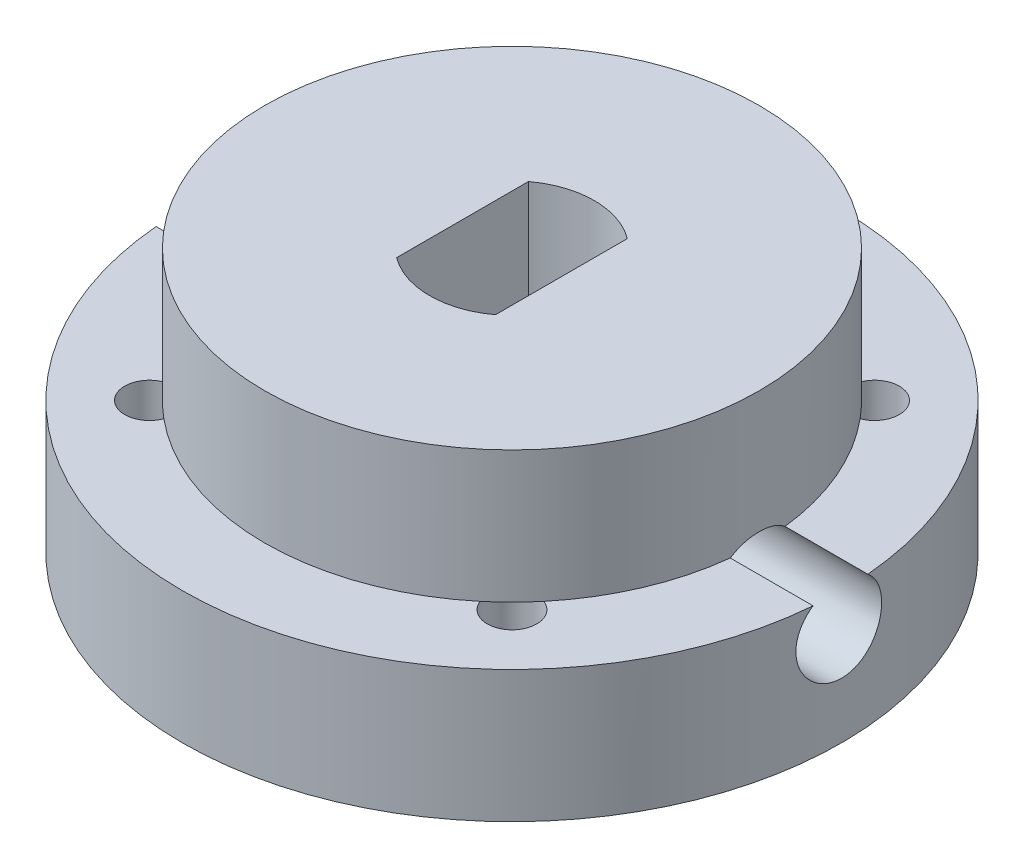
ISO-10303-21;
HEADER;
FILE_DESCRIPTION(('STEP AP214'),'2;1');
FILE_NAME('part.step','',(''),(''),'','','');
FILE_SCHEMA(('AUTOMOTIVE_DESIGN { 1 0 10303 214 1 1 1 1 }'));
ENDSEC;
DATA;
#1=APPLICATION_CONTEXT('core data for automotive mechanical design processes');
#2=APPLICATION_PROTOCOL_DEFINITION('international standard','automotive_design',2000,#1);
#3=PRODUCT_CONTEXT('',#1,'mechanical');
#4=PRODUCT('Part','Part','',(#3));
#5=PRODUCT_RELATED_PRODUCT_CATEGORY('part','',(#4));
#6=PRODUCT_DEFINITION_FORMATION('','',#4);
#7=PRODUCT_DEFINITION_CONTEXT('part definition',#1,'design');
#8=PRODUCT_DEFINITION('design','',#6,#7);
#9=PRODUCT_DEFINITION_SHAPE('','',#8);
#10=(LENGTH_UNIT() NAMED_UNIT(*) SI_UNIT(.MILLI.,.METRE.));
#11=(NAMED_UNIT(*) PLANE_ANGLE_UNIT() SI_UNIT($,.RADIAN.));
#12=(NAMED_UNIT(*) SI_UNIT($,.STERADIAN.) SOLID_ANGLE_UNIT());
#13=UNCERTAINTY_MEASURE_WITH_UNIT(LENGTH_MEASURE(1.E-05),#10,'distance_accuracy_value','');
#14=(GEOMETRIC_REPRESENTATION_CONTEXT(3) GLOBAL_UNCERTAINTY_ASSIGNED_CONTEXT((#13)) GLOBAL_UNIT_ASSIGNED_CONTEXT((#10,
#11,#12)) REPRESENTATION_CONTEXT('',''));
#15=CARTESIAN_POINT('',(0.,0.,0.));
#16=DIRECTION('',(0.,0.,1.));
#17=DIRECTION('',(1.,0.,0.));
#18=AXIS2_PLACEMENT_3D('',#15,#16,#17);
#19=CARTESIAN_POINT('',(0.,4.,0.));
#20=DIRECTION('',(0.,1.,0.));
#21=DIRECTION('',(0.,0.,1.));
#22=AXIS2_PLACEMENT_3D('',#19,#20,#21);
#23=PLANE('',#22);
#24=CARTESIAN_POINT('',(-5.5,4.,5.5));
#25=DIRECTION('',(0.,1.,0.));
#26=DIRECTION('',(0.,0.,1.));
#27=AXIS2_PLACEMENT_3D('',#24,#25,#26);
#28=CIRCLE('',#27,0.75);
#29=CARTESIAN_POINT('',(-5.76436327605439,4.,4.79813672394561));
#30=VERTEX_POINT('',#29);
#31=CARTESIAN_POINT('',(-4.79813672394561,4.,5.76436327605439));
#32=VERTEX_POINT('',#31);
#33=EDGE_CURVE('E518',#30,#32,#28,.T.);
#34=ORIENTED_EDGE('',*,*,#33,.F.);
#35=CARTESIAN_POINT('',(0.,4.,0.));
#36=DIRECTION('',(0.,1.,0.));
#37=DIRECTION('',(0.,0.,1.));
#38=AXIS2_PLACEMENT_3D('',#35,#36,#37);
#39=CIRCLE('',#38,7.5);
#40=CARTESIAN_POINT('',(-7.45385806143369,4.,0.830662386291808));
#41=VERTEX_POINT('',#40);
#42=EDGE_CURVE('E166',#41,#30,#39,.T.);
#43=ORIENTED_EDGE('',*,*,#42,.F.);
#44=DIRECTION('',(1.,0.,0.));
#45=VECTOR('',#44,1.);
#46=CARTESIAN_POINT('',(-10.,4.,0.830662386291809));
#47=LINE('',#46,#45);
#48=CARTESIAN_POINT('',(-9.96544028129214,4.,0.830662386291809));
#49=VERTEX_POINT('',#48);
#50=EDGE_CURVE('E266',#49,#41,#47,.T.);
#51=ORIENTED_EDGE('',*,*,#50,.F.);
#52=CARTESIAN_POINT('',(0.,4.,0.));
#53=DIRECTION('',(0.,1.,0.));
#54=DIRECTION('',(0.,0.,1.));
#55=AXIS2_PLACEMENT_3D('',#52,#53,#54);
#56=CIRCLE('',#55,10.);
#57=CARTESIAN_POINT('',(9.96544028129214,4.,0.830662386291806));
#58=VERTEX_POINT('',#57);
#59=EDGE_CURVE('E178',#49,#58,#56,.T.);
#60=ORIENTED_EDGE('',*,*,#59,.T.);
#61=CARTESIAN_POINT('',(7.45385806143369,4.,0.830662386291807));
#62=VERTEX_POINT('',#61);
#63=EDGE_CURVE('E257',#62,#58,#47,.T.);
#64=ORIENTED_EDGE('',*,*,#63,.F.);
#65=CARTESIAN_POINT('',(5.76436327605439,4.,4.79813672394561));
#66=VERTEX_POINT('',#65);
#67=EDGE_CURVE('E165',#66,#62,#39,.T.);
#68=ORIENTED_EDGE('',*,*,#67,.F.);
#69=CARTESIAN_POINT('',(5.5,4.,5.5));
#70=DIRECTION('',(0.,1.,0.));
#71=DIRECTION('',(0.,0.,1.));
#72=AXIS2_PLACEMENT_3D('',#69,#70,#71);
#73=CIRCLE('',#72,0.75);
#74=CARTESIAN_POINT('',(4.79813672394561,4.,5.76436327605439));
#75=VERTEX_POINT('',#74);
#76=EDGE_CURVE('E530',#75,#66,#73,.T.);
#77=ORIENTED_EDGE('',*,*,#76,.F.);
#78=EDGE_CURVE('E493',#32,#75,#39,.T.);
#79=ORIENTED_EDGE('',*,*,#78,.F.);
#80=EDGE_LOOP('',(#34,#43,#51,#60,#64,#68,#77,#79));
#81=FACE_BOUND('',#80,.T.);
#82=ADVANCED_FACE('F38',(#81),#23,.T.);
#83=CARTESIAN_POINT('',(0.,8.,0.));
#84=DIRECTION('',(0.,1.,0.));
#85=DIRECTION('',(0.,0.,1.));
#86=AXIS2_PLACEMENT_3D('',#83,#84,#85);
#87=PLANE('',#86);
#88=DIRECTION('',(0.,0.,-1.));
#89=VECTOR('',#88,1.);
#90=CARTESIAN_POINT('',(1.5,8.,-2.));
#91=LINE('',#90,#89);
#92=CARTESIAN_POINT('',(1.5,8.,2.));
#93=VERTEX_POINT('',#92);
#94=CARTESIAN_POINT('',(1.5,8.,-2.));
#95=VERTEX_POINT('',#94);
#96=EDGE_CURVE('E186',#93,#95,#91,.T.);
#97=ORIENTED_EDGE('',*,*,#96,.F.);
#98=CARTESIAN_POINT('',(0.,8.,0.));
#99=DIRECTION('',(0.,1.,0.));
#100=DIRECTION('',(0.,0.,1.));
#101=AXIS2_PLACEMENT_3D('',#98,#99,#100);
#102=CIRCLE('',#101,2.5);
#103=CARTESIAN_POINT('',(-1.5,8.,2.));
#104=VERTEX_POINT('',#103);
#105=EDGE_CURVE('E183',#104,#93,#102,.T.);
#106=ORIENTED_EDGE('',*,*,#105,.F.);
#107=DIRECTION('',(0.,0.,1.));
#108=VECTOR('',#107,1.);
#109=CARTESIAN_POINT('',(-1.5,8.,-2.));
#110=LINE('',#109,#108);
#111=CARTESIAN_POINT('',(-1.5,8.,-2.));
#112=VERTEX_POINT('',#111);
#113=EDGE_CURVE('E194',#112,#104,#110,.T.);
#114=ORIENTED_EDGE('',*,*,#113,.F.);
#115=CARTESIAN_POINT('',(0.,8.,0.));
#116=DIRECTION('',(0.,1.,0.));
#117=DIRECTION('',(0.,0.,1.));
#118=AXIS2_PLACEMENT_3D('',#115,#116,#117);
#119=CIRCLE('',#118,2.5);
#120=EDGE_CURVE('E190',#95,#112,#119,.T.);
#121=ORIENTED_EDGE('',*,*,#120,.F.);
#122=EDGE_LOOP('',(#97,#106,#114,#121));
#123=FACE_BOUND('',#122,.T.);
#124=CARTESIAN_POINT('',(0.,8.,0.));
#125=DIRECTION('',(0.,1.,0.));
#126=DIRECTION('',(0.,0.,1.));
#127=AXIS2_PLACEMENT_3D('',#124,#125,#126);
#128=CIRCLE('',#127,7.5);
#129=CARTESIAN_POINT('',(0.,8.,7.5));
#130=VERTEX_POINT('',#129);
#131=EDGE_CURVE('E174',#130,#130,#128,.T.);
#132=ORIENTED_EDGE('',*,*,#131,.T.);
#133=EDGE_LOOP('',(#132));
#134=FACE_BOUND('',#133,.T.);
#135=ADVANCED_FACE('F296',(#123,#134),#87,.T.);
#136=CARTESIAN_POINT('',(0.,8.,0.));
#137=DIRECTION('',(0.,-1.,0.));
#138=DIRECTION('',(0.,0.,-1.));
#139=AXIS2_PLACEMENT_3D('',#136,#137,#138);
#140=CYLINDRICAL_SURFACE('',#139,10.);
#141=CARTESIAN_POINT('',(0.,0.,0.));
#142=DIRECTION('',(0.,1.,0.));
#143=DIRECTION('',(0.,0.,1.));
#144=AXIS2_PLACEMENT_3D('',#141,#142,#143);
#145=CIRCLE('',#144,10.);
#146=CARTESIAN_POINT('',(0.,0.,10.));
#147=VERTEX_POINT('',#146);
#148=EDGE_CURVE('E226',#147,#147,#145,.T.);
#149=ORIENTED_EDGE('',*,*,#148,.T.);
#150=EDGE_LOOP('',(#149));
#151=FACE_BOUND('',#150,.T.);
#152=CARTESIAN_POINT('',(9.96544028129214,4.,-0.830662386291809));
#153=VERTEX_POINT('',#152);
#154=CARTESIAN_POINT('',(-9.96544028129214,4.,-0.830662386291806));
#155=VERTEX_POINT('',#154);
#156=EDGE_CURVE('E182',#153,#155,#56,.T.);
#157=ORIENTED_EDGE('',*,*,#156,.F.);
#158=CARTESIAN_POINT('',(9.96544028129214,4.,-0.830662386291809));
#159=CARTESIAN_POINT('',(9.96309522571565,3.97662801528229,-0.858798244062416));
#160=CARTESIAN_POINT('',(9.96071329344494,3.95208132938374,-0.885932286120238));
#161=CARTESIAN_POINT('',(9.95594152209699,3.90079185570492,-0.938036178487752));
#162=CARTESIAN_POINT('',(9.95355168327193,3.87404913733551,-0.963006097148496));
#163=CARTESIAN_POINT('',(9.94647492969885,3.79082613091712,-1.03437002926309));
#164=CARTESIAN_POINT('',(9.94187439205798,3.73128993266063,-1.07729158407199));
#165=CARTESIAN_POINT('',(9.93343262400773,3.60580728958185,-1.15254496332038));
#166=CARTESIAN_POINT('',(9.92959182890697,3.53985720189403,-1.1848707236312));
#167=CARTESIAN_POINT('',(9.92311002700236,3.40341952557906,-1.23798482679803));
#168=CARTESIAN_POINT('',(9.92046864204885,3.33293337509341,-1.25877680647964));
#169=CARTESIAN_POINT('',(9.91669892414851,3.18976843375656,-1.28813955005976));
#170=CARTESIAN_POINT('',(9.91556352834026,3.1171015242842,-1.29676737409455));
#171=CARTESIAN_POINT('',(9.91491352648926,2.97133047862506,-1.30172830240424));
#172=CARTESIAN_POINT('',(9.91539913750724,2.89822628519221,-1.2980597601355));
#173=CARTESIAN_POINT('',(9.91792802717706,2.75411502543761,-1.2785918671558));
#174=CARTESIAN_POINT('',(9.91996224266507,2.68309824513581,-1.26286309475621));
#175=CARTESIAN_POINT('',(9.92534599666605,2.54472359939297,-1.21982514507657));
#176=CARTESIAN_POINT('',(9.92869548081926,2.477365582867,-1.19251644638851));
#177=CARTESIAN_POINT('',(9.93634692160484,2.34793882114314,-1.12698572580585));
#178=CARTESIAN_POINT('',(9.94065228275788,2.28589010867712,-1.08872455019721));
#179=CARTESIAN_POINT('',(9.94972655475813,2.16906287034768,-1.00240665158262));
#180=CARTESIAN_POINT('',(9.95449549801849,2.11428485347744,-0.954349243377019));
#181=CARTESIAN_POINT('',(9.9640021307004,2.01313724228269,-0.849383627775918));
#182=CARTESIAN_POINT('',(9.96873933519537,1.9668321889642,-0.792413157838672));
#183=CARTESIAN_POINT('',(9.97761496147652,1.88443569041911,-0.671468761522795));
#184=CARTESIAN_POINT('',(9.9817533880997,1.84834416268398,-0.607494891725932));
#185=CARTESIAN_POINT('',(9.98896510133371,1.7874229846691,-0.474356770533519));
#186=CARTESIAN_POINT('',(9.99203870175737,1.76259001573458,-0.40519405565474));
#187=CARTESIAN_POINT('',(9.99677496008932,1.7249069281372,-0.263632074972039));
#188=CARTESIAN_POINT('',(9.99843768876421,1.71205620846455,-0.191232971690908));
#189=CARTESIAN_POINT('',(10.0001573627237,1.69877326306443,-0.0458245369930569));
#190=CARTESIAN_POINT('',(10.0002260436737,1.69825027789764,0.0271763737146332));
#191=CARTESIAN_POINT('',(9.99877993644529,1.70940711495921,0.1722222401125));
#192=CARTESIAN_POINT('',(9.99726517828053,1.72108670589096,0.244267213895995));
#193=CARTESIAN_POINT('',(9.99282849709599,1.75624701186521,0.385141137260207));
#194=CARTESIAN_POINT('',(9.98991076681607,1.77969257371721,0.453979003125628));
#195=CARTESIAN_POINT('',(9.98299303099722,1.83768573678692,0.586748571594869));
#196=CARTESIAN_POINT('',(9.97899298424614,1.87223376077049,0.650680087257038));
#197=CARTESIAN_POINT('',(9.97032524339025,1.95169231152417,0.772240306990696));
#198=CARTESIAN_POINT('',(9.96565370156899,1.99666354217432,0.829829054230541));
#199=CARTESIAN_POINT('',(9.95618034353506,2.09559650767105,0.936672653274716));
#200=CARTESIAN_POINT('',(9.95137852163284,2.14955863569727,0.98592714042476));
#201=CARTESIAN_POINT('',(9.94215356770678,2.26531707089288,1.07499040917565));
#202=CARTESIAN_POINT('',(9.93773278159668,2.32715680144082,1.11474302601118));
#203=CARTESIAN_POINT('',(9.92980426959655,2.45669005224223,1.18329342381518));
#204=CARTESIAN_POINT('',(9.9262965146176,2.52438338590993,1.2120915538041));
#205=CARTESIAN_POINT('',(9.9206072316134,2.66346613689633,1.25780959129629));
#206=CARTESIAN_POINT('',(9.91842120294553,2.73484210275729,1.27476983907879));
#207=CARTESIAN_POINT('',(9.91560927270301,2.87945737386935,1.29646237648297));
#208=CARTESIAN_POINT('',(9.91498328785668,2.95269657945401,1.30119531877178));
#209=CARTESIAN_POINT('',(9.91536235908055,3.09837934863757,1.29830300469384));
#210=CARTESIAN_POINT('',(9.91635534114493,3.17082478250817,1.29076923215564));
#211=CARTESIAN_POINT('',(9.91983615731703,3.31342015842906,1.2637379291268));
#212=CARTESIAN_POINT('',(9.92232416293048,3.38356983614166,1.24423902601783));
#213=CARTESIAN_POINT('',(9.92851356951123,3.5196237690783,1.19384245675685));
#214=CARTESIAN_POINT('',(9.93221565594692,3.58552560076489,1.16293835000373));
#215=CARTESIAN_POINT('',(9.940416237673,3.71120040021629,1.09061477545916));
#216=CARTESIAN_POINT('',(9.94491417322621,3.77097762918453,1.04920268931906));
#217=CARTESIAN_POINT('',(9.95217568262102,3.85836694255075,0.977179361100513));
#218=CARTESIAN_POINT('',(9.95484084620306,3.88864370064681,0.949726044435168));
#219=CARTESIAN_POINT('',(9.96016610003118,3.94643167966778,0.892147554858455));
#220=CARTESIAN_POINT('',(9.96282619080225,3.97394776387938,0.862027262943277));
#221=CARTESIAN_POINT('',(9.96544028129214,4.,0.830662386291807));
#222=B_SPLINE_CURVE_WITH_KNOTS('',3,(#158,#159,#160,#161,#162,#163,#164,#165,#166,#167,#168,
#169,#170,#171,#172,#173,#174,#175,#176,#177,#178,#179,#180,#181,#182,#183,#184,#185,#186,#187,
#188,#189,#190,#191,#192,#193,#194,#195,#196,#197,#198,#199,#200,#201,#202,#203,#204,#205,#206,
#207,#208,#209,#210,#211,#212,#213,#214,#215,#216,#217,#218,#219,#220,#221),.UNSPECIFIED.,.F.,
.F.,(4,2,2,2,2,2,2,2,2,2,2,2,2,2,2,2,2,2,2,2,2,2,2,2,2,2,2,2,2,2,2,4),(0.,0.109888751043253,
0.219774030125979,0.439261235949137,0.658873839079959,0.878417154661076,1.09692716132454,
1.3154664287165,1.5327364411283,1.74999747476529,1.96804510177886,2.1861079854185,
2.40576842026147,2.62542708055801,2.84502095050424,3.06460380539308,3.28256953497655,
3.50053113315217,3.71784537018904,3.9351678832216,4.1537893637731,4.37242040733993,
4.5923134589597,4.81219950398938,5.03133252991092,5.25045385874368,5.46794847681131,
5.68546805013736,5.90311064676914,6.12060077494443,6.24330972041216,6.36579855573759),.UNSPECIFIED.);
#223=EDGE_CURVE('E249',#153,#58,#222,.T.);
#224=ORIENTED_EDGE('',*,*,#223,.T.);
#225=ORIENTED_EDGE('',*,*,#59,.F.);
#226=CARTESIAN_POINT('',(-9.96544028129214,4.,0.830662386291809));
#227=CARTESIAN_POINT('',(-9.96309522571565,3.97662801528229,0.858798244062416));
#228=CARTESIAN_POINT('',(-9.96071329344494,3.95208132938374,0.885932286120238));
#229=CARTESIAN_POINT('',(-9.95594152209699,3.90079185570492,0.938036178487752));
#230=CARTESIAN_POINT('',(-9.95355168327193,3.87404913733551,0.963006097148496));
#231=CARTESIAN_POINT('',(-9.94647492969885,3.79082613091712,1.03437002926309));
#232=CARTESIAN_POINT('',(-9.94187439205798,3.73128993266063,1.07729158407199));
#233=CARTESIAN_POINT('',(-9.93343262400773,3.60580728958185,1.15254496332038));
#234=CARTESIAN_POINT('',(-9.92959182890697,3.53985720189403,1.1848707236312));
#235=CARTESIAN_POINT('',(-9.92311002700236,3.40341952557906,1.23798482679803));
#236=CARTESIAN_POINT('',(-9.92046864204885,3.33293337509341,1.25877680647964));
#237=CARTESIAN_POINT('',(-9.91669892414851,3.18976843375656,1.28813955005976));
#238=CARTESIAN_POINT('',(-9.91556352834026,3.1171015242842,1.29676737409455));
#239=CARTESIAN_POINT('',(-9.91491352648926,2.97133047862506,1.30172830240424));
#240=CARTESIAN_POINT('',(-9.91539913750724,2.89822628519221,1.2980597601355));
#241=CARTESIAN_POINT('',(-9.91792802717706,2.75411502543761,1.2785918671558));
#242=CARTESIAN_POINT('',(-9.91996224266507,2.68309824513581,1.26286309475621));
#243=CARTESIAN_POINT('',(-9.92534599666605,2.54472359939297,1.21982514507657));
#244=CARTESIAN_POINT('',(-9.92869548081926,2.477365582867,1.19251644638851));
#245=CARTESIAN_POINT('',(-9.93634692160484,2.34793882114314,1.12698572580585));
#246=CARTESIAN_POINT('',(-9.94065228275788,2.28589010867712,1.08872455019721));
#247=CARTESIAN_POINT('',(-9.94972655475813,2.16906287034768,1.00240665158262));
#248=CARTESIAN_POINT('',(-9.95449549801849,2.11428485347744,0.954349243377019));
#249=CARTESIAN_POINT('',(-9.9640021307004,2.01313724228269,0.849383627775918));
#250=CARTESIAN_POINT('',(-9.96873933519537,1.9668321889642,0.792413157838672));
#251=CARTESIAN_POINT('',(-9.97761496147652,1.88443569041911,0.671468761522795));
#252=CARTESIAN_POINT('',(-9.9817533880997,1.84834416268398,0.607494891725932));
#253=CARTESIAN_POINT('',(-9.98896510133371,1.7874229846691,0.474356770533519));
#254=CARTESIAN_POINT('',(-9.99203870175737,1.76259001573458,0.40519405565474));
#255=CARTESIAN_POINT('',(-9.99677496008932,1.7249069281372,0.263632074972039));
#256=CARTESIAN_POINT('',(-9.99843768876421,1.71205620846455,0.191232971690908));
#257=CARTESIAN_POINT('',(-10.0001573627237,1.69877326306443,0.0458245369930569));
#258=CARTESIAN_POINT('',(-10.0002260436737,1.69825027789764,-0.0271763737146332));
#259=CARTESIAN_POINT('',(-9.99877993644529,1.70940711495921,-0.1722222401125));
#260=CARTESIAN_POINT('',(-9.99726517828053,1.72108670589096,-0.244267213895995));
#261=CARTESIAN_POINT('',(-9.99282849709599,1.75624701186521,-0.385141137260207));
#262=CARTESIAN_POINT('',(-9.98991076681607,1.77969257371721,-0.453979003125628));
#263=CARTESIAN_POINT('',(-9.98299303099722,1.83768573678692,-0.586748571594869));
#264=CARTESIAN_POINT('',(-9.97899298424614,1.87223376077049,-0.650680087257038));
#265=CARTESIAN_POINT('',(-9.97032524339025,1.95169231152417,-0.772240306990696));
#266=CARTESIAN_POINT('',(-9.96565370156899,1.99666354217432,-0.829829054230541));
#267=CARTESIAN_POINT('',(-9.95618034353506,2.09559650767105,-0.936672653274716));
#268=CARTESIAN_POINT('',(-9.95137852163284,2.14955863569727,-0.98592714042476));
#269=CARTESIAN_POINT('',(-9.94215356770678,2.26531707089288,-1.07499040917565));
#270=CARTESIAN_POINT('',(-9.93773278159668,2.32715680144082,-1.11474302601118));
#271=CARTESIAN_POINT('',(-9.92980426959655,2.45669005224223,-1.18329342381518));
#272=CARTESIAN_POINT('',(-9.9262965146176,2.52438338590993,-1.2120915538041));
#273=CARTESIAN_POINT('',(-9.9206072316134,2.66346613689633,-1.25780959129629));
#274=CARTESIAN_POINT('',(-9.91842120294553,2.73484210275729,-1.27476983907879));
#275=CARTESIAN_POINT('',(-9.91560927270301,2.87945737386935,-1.29646237648297));
#276=CARTESIAN_POINT('',(-9.91498328785668,2.95269657945401,-1.30119531877178));
#277=CARTESIAN_POINT('',(-9.91536235908055,3.09837934863757,-1.29830300469384));
#278=CARTESIAN_POINT('',(-9.91635534114493,3.17082478250817,-1.29076923215564));
#279=CARTESIAN_POINT('',(-9.91983615731703,3.31342015842906,-1.2637379291268));
#280=CARTESIAN_POINT('',(-9.92232416293048,3.38356983614166,-1.24423902601783));
#281=CARTESIAN_POINT('',(-9.92851356951123,3.5196237690783,-1.19384245675685));
#282=CARTESIAN_POINT('',(-9.93221565594692,3.58552560076489,-1.16293835000373));
#283=CARTESIAN_POINT('',(-9.940416237673,3.71120040021629,-1.09061477545916));
#284=CARTESIAN_POINT('',(-9.94491417322621,3.77097762918453,-1.04920268931906));
#285=CARTESIAN_POINT('',(-9.95217568262102,3.85836694255075,-0.977179361100513));
#286=CARTESIAN_POINT('',(-9.95484084620306,3.88864370064681,-0.949726044435168));
#287=CARTESIAN_POINT('',(-9.96016610003118,3.94643167966778,-0.892147554858455));
#288=CARTESIAN_POINT('',(-9.96282619080225,3.97394776387938,-0.862027262943277));
#289=CARTESIAN_POINT('',(-9.96544028129214,4.,-0.830662386291807));
#290=B_SPLINE_CURVE_WITH_KNOTS('',3,(#226,#227,#228,#229,#230,#231,#232,#233,#234,#235,#236,
#237,#238,#239,#240,#241,#242,#243,#244,#245,#246,#247,#248,#249,#250,#251,#252,#253,#254,#255,
#256,#257,#258,#259,#260,#261,#262,#263,#264,#265,#266,#267,#268,#269,#270,#271,#272,#273,#274,
#275,#276,#277,#278,#279,#280,#281,#282,#283,#284,#285,#286,#287,#288,#289),.UNSPECIFIED.,.F.,
.F.,(4,2,2,2,2,2,2,2,2,2,2,2,2,2,2,2,2,2,2,2,2,2,2,2,2,2,2,2,2,2,2,4),(0.,0.109888751043253,
0.219774030125979,0.439261235949137,0.658873839079959,0.878417154661076,1.09692716132454,
1.3154664287165,1.5327364411283,1.74999747476529,1.96804510177886,2.1861079854185,
2.40576842026147,2.62542708055801,2.84502095050424,3.06460380539308,3.28256953497655,
3.50053113315217,3.71784537018904,3.9351678832216,4.1537893637731,4.37242040733993,
4.5923134589597,4.81219950398938,5.03133252991092,5.25045385874368,5.46794847681131,
5.68546805013736,5.90311064676914,6.12060077494443,6.24330972041216,6.36579855573759),.UNSPECIFIED.);
#291=EDGE_CURVE('E259',#49,#155,#290,.T.);
#292=ORIENTED_EDGE('',*,*,#291,.T.);
#293=EDGE_LOOP('',(#157,#224,#225,#292));
#294=FACE_BOUND('',#293,.T.);
#295=ADVANCED_FACE('F40',(#151,#294),#140,.T.);
#296=CARTESIAN_POINT('',(0.,0.,0.));
#297=DIRECTION('',(0.,1.,0.));
#298=DIRECTION('',(0.,0.,1.));
#299=AXIS2_PLACEMENT_3D('',#296,#297,#298);
#300=PLANE('',#299);
#301=CARTESIAN_POINT('',(5.5,0.,-5.5));
#302=DIRECTION('',(0.,1.,0.));
#303=DIRECTION('',(0.,0.,1.));
#304=AXIS2_PLACEMENT_3D('',#301,#302,#303);
#305=CIRCLE('',#304,0.75);
#306=CARTESIAN_POINT('',(5.5,0.,-4.75));
#307=VERTEX_POINT('',#306);
#308=EDGE_CURVE('E148',#307,#307,#305,.T.);
#309=ORIENTED_EDGE('',*,*,#308,.T.);
#310=EDGE_LOOP('',(#309));
#311=FACE_BOUND('',#310,.T.);
#312=CARTESIAN_POINT('',(-5.5,0.,5.5));
#313=DIRECTION('',(0.,1.,0.));
#314=DIRECTION('',(0.,0.,1.));
#315=AXIS2_PLACEMENT_3D('',#312,#313,#314);
#316=CIRCLE('',#315,0.75);
#317=CARTESIAN_POINT('',(-5.5,0.,6.25));
#318=VERTEX_POINT('',#317);
#319=EDGE_CURVE('E471',#318,#318,#316,.T.);
#320=ORIENTED_EDGE('',*,*,#319,.T.);
#321=EDGE_LOOP('',(#320));
#322=FACE_BOUND('',#321,.T.);
#323=CARTESIAN_POINT('',(5.5,0.,5.5));
#324=DIRECTION('',(0.,1.,0.));
#325=DIRECTION('',(0.,0.,1.));
#326=AXIS2_PLACEMENT_3D('',#323,#324,#325);
#327=CIRCLE('',#326,0.75);
#328=CARTESIAN_POINT('',(5.5,0.,6.25));
#329=VERTEX_POINT('',#328);
#330=EDGE_CURVE('E475',#329,#329,#327,.T.);
#331=ORIENTED_EDGE('',*,*,#330,.T.);
#332=EDGE_LOOP('',(#331));
#333=FACE_BOUND('',#332,.T.);
#334=CARTESIAN_POINT('',(-5.5,0.,-5.5));
#335=DIRECTION('',(0.,1.,0.));
#336=DIRECTION('',(0.,0.,1.));
#337=AXIS2_PLACEMENT_3D('',#334,#335,#336);
#338=CIRCLE('',#337,0.75);
#339=CARTESIAN_POINT('',(-5.5,0.,-4.75));
#340=VERTEX_POINT('',#339);
#341=EDGE_CURVE('E156',#340,#340,#338,.T.);
#342=ORIENTED_EDGE('',*,*,#341,.T.);
#343=EDGE_LOOP('',(#342));
#344=FACE_BOUND('',#343,.T.);
#345=ORIENTED_EDGE('',*,*,#148,.F.);
#346=EDGE_LOOP('',(#345));
#347=FACE_BOUND('',#346,.T.);
#348=CARTESIAN_POINT('',(0.,0.,0.));
#349=DIRECTION('',(0.,1.,0.));
#350=DIRECTION('',(0.,0.,1.));
#351=AXIS2_PLACEMENT_3D('',#348,#349,#350);
#352=CIRCLE('',#351,2.5);
#353=CARTESIAN_POINT('',(-1.5,0.,2.));
#354=VERTEX_POINT('',#353);
#355=CARTESIAN_POINT('',(1.5,0.,2.));
#356=VERTEX_POINT('',#355);
#357=EDGE_CURVE('E198',#354,#356,#352,.T.);
#358=ORIENTED_EDGE('',*,*,#357,.T.);
#359=DIRECTION('',(0.,0.,-1.));
#360=VECTOR('',#359,1.);
#361=CARTESIAN_POINT('',(1.5,0.,-2.));
#362=LINE('',#361,#360);
#363=CARTESIAN_POINT('',(1.5,0.,-2.));
#364=VERTEX_POINT('',#363);
#365=EDGE_CURVE('E202',#356,#364,#362,.T.);
#366=ORIENTED_EDGE('',*,*,#365,.T.);
#367=CARTESIAN_POINT('',(0.,0.,0.));
#368=DIRECTION('',(0.,1.,0.));
#369=DIRECTION('',(0.,0.,1.));
#370=AXIS2_PLACEMENT_3D('',#367,#368,#369);
#371=CIRCLE('',#370,2.5);
#372=CARTESIAN_POINT('',(-1.5,0.,-2.));
#373=VERTEX_POINT('',#372);
#374=EDGE_CURVE('E206',#364,#373,#371,.T.);
#375=ORIENTED_EDGE('',*,*,#374,.T.);
#376=DIRECTION('',(0.,0.,1.));
#377=VECTOR('',#376,1.);
#378=CARTESIAN_POINT('',(-1.5,0.,-2.));
#379=LINE('',#378,#377);
#380=EDGE_CURVE('E187',#373,#354,#379,.T.);
#381=ORIENTED_EDGE('',*,*,#380,.T.);
#382=EDGE_LOOP('',(#358,#366,#375,#381));
#383=FACE_BOUND('',#382,.T.);
#384=ADVANCED_FACE('F290',(#311,#322,#333,#344,#347,#383),#300,.F.);
#385=CARTESIAN_POINT('',(0.,8.,0.));
#386=DIRECTION('',(0.,-1.,0.));
#387=DIRECTION('',(0.,0.,-1.));
#388=AXIS2_PLACEMENT_3D('',#385,#386,#387);
#389=CYLINDRICAL_SURFACE('',#388,2.5);
#390=ORIENTED_EDGE('',*,*,#357,.F.);
#391=DIRECTION('',(0.,-1.,0.));
#392=VECTOR('',#391,1.);
#393=CARTESIAN_POINT('',(-1.5,8.,2.));
#394=LINE('',#393,#392);
#395=EDGE_CURVE('E197',#104,#354,#394,.T.);
#396=ORIENTED_EDGE('',*,*,#395,.F.);
#397=ORIENTED_EDGE('',*,*,#105,.T.);
#398=DIRECTION('',(0.,-1.,0.));
#399=VECTOR('',#398,1.);
#400=CARTESIAN_POINT('',(1.5,8.,2.));
#401=LINE('',#400,#399);
#402=EDGE_CURVE('E222',#93,#356,#401,.T.);
#403=ORIENTED_EDGE('',*,*,#402,.T.);
#404=EDGE_LOOP('',(#390,#396,#397,#403));
#405=FACE_BOUND('',#404,.T.);
#406=ADVANCED_FACE('F280',(#405),#389,.F.);
#407=CARTESIAN_POINT('',(1.5,8.,-2.));
#408=DIRECTION('',(-1.,0.,0.));
#409=DIRECTION('',(0.,0.,1.));
#410=AXIS2_PLACEMENT_3D('',#407,#408,#409);
#411=PLANE('',#410);
#412=CARTESIAN_POINT('',(1.5,3.,0.));
#413=DIRECTION('',(-1.,0.,0.));
#414=DIRECTION('',(0.,0.,1.));
#415=AXIS2_PLACEMENT_3D('',#412,#413,#414);
#416=CIRCLE('',#415,1.3);
#417=CARTESIAN_POINT('',(1.5,3.,1.3));
#418=VERTEX_POINT('',#417);
#419=EDGE_CURVE('E172',#418,#418,#416,.T.);
#420=ORIENTED_EDGE('',*,*,#419,.F.);
#421=EDGE_LOOP('',(#420));
#422=FACE_BOUND('',#421,.T.);
#423=ORIENTED_EDGE('',*,*,#365,.F.);
#424=ORIENTED_EDGE('',*,*,#402,.F.);
#425=ORIENTED_EDGE('',*,*,#96,.T.);
#426=DIRECTION('',(0.,-1.,0.));
#427=VECTOR('',#426,1.);
#428=CARTESIAN_POINT('',(1.5,8.,-2.));
#429=LINE('',#428,#427);
#430=EDGE_CURVE('E219',#95,#364,#429,.T.);
#431=ORIENTED_EDGE('',*,*,#430,.T.);
#432=EDGE_LOOP('',(#423,#424,#425,#431));
#433=FACE_BOUND('',#432,.T.);
#434=ADVANCED_FACE('F276',(#422,#433),#411,.T.);
#435=CARTESIAN_POINT('',(0.,8.,0.));
#436=DIRECTION('',(0.,-1.,0.));
#437=DIRECTION('',(0.,0.,-1.));
#438=AXIS2_PLACEMENT_3D('',#435,#436,#437);
#439=CYLINDRICAL_SURFACE('',#438,2.5);
#440=ORIENTED_EDGE('',*,*,#374,.F.);
#441=ORIENTED_EDGE('',*,*,#430,.F.);
#442=ORIENTED_EDGE('',*,*,#120,.T.);
#443=DIRECTION('',(0.,-1.,0.));
#444=VECTOR('',#443,1.);
#445=CARTESIAN_POINT('',(-1.5,8.,-2.));
#446=LINE('',#445,#444);
#447=EDGE_CURVE('E216',#112,#373,#446,.T.);
#448=ORIENTED_EDGE('',*,*,#447,.T.);
#449=EDGE_LOOP('',(#440,#441,#442,#448));
#450=FACE_BOUND('',#449,.T.);
#451=ADVANCED_FACE('F279',(#450),#439,.F.);
#452=CARTESIAN_POINT('',(-1.5,8.,-2.));
#453=DIRECTION('',(1.,0.,0.));
#454=DIRECTION('',(0.,0.,-1.));
#455=AXIS2_PLACEMENT_3D('',#452,#453,#454);
#456=PLANE('',#455);
#457=CARTESIAN_POINT('',(-1.5,3.,0.));
#458=DIRECTION('',(1.,0.,0.));
#459=DIRECTION('',(0.,0.,-1.));
#460=AXIS2_PLACEMENT_3D('',#457,#458,#459);
#461=CIRCLE('',#460,1.3);
#462=CARTESIAN_POINT('',(-1.5,3.,-1.3));
#463=VERTEX_POINT('',#462);
#464=EDGE_CURVE('E265',#463,#463,#461,.T.);
#465=ORIENTED_EDGE('',*,*,#464,.F.);
#466=EDGE_LOOP('',(#465));
#467=FACE_BOUND('',#466,.T.);
#468=ORIENTED_EDGE('',*,*,#380,.F.);
#469=ORIENTED_EDGE('',*,*,#447,.F.);
#470=ORIENTED_EDGE('',*,*,#113,.T.);
#471=ORIENTED_EDGE('',*,*,#395,.T.);
#472=EDGE_LOOP('',(#468,#469,#470,#471));
#473=FACE_BOUND('',#472,.T.);
#474=ADVANCED_FACE('F293',(#467,#473),#456,.T.);
#475=CARTESIAN_POINT('',(5.5,4.,-5.5));
#476=DIRECTION('',(0.,1.,0.));
#477=DIRECTION('',(0.,0.,1.));
#478=AXIS2_PLACEMENT_3D('',#475,#476,#477);
#479=CIRCLE('',#478,0.75);
#480=CARTESIAN_POINT('',(5.76436327605438,4.,-4.79813672394562));
#481=VERTEX_POINT('',#480);
#482=CARTESIAN_POINT('',(4.79813672394561,4.,-5.76436327605439));
#483=VERTEX_POINT('',#482);
#484=EDGE_CURVE('E67',#481,#483,#479,.T.);
#485=ORIENTED_EDGE('',*,*,#484,.F.);
#486=CARTESIAN_POINT('',(7.45385806143369,4.,-0.830662386291808));
#487=VERTEX_POINT('',#486);
#488=EDGE_CURVE('E164',#487,#481,#39,.T.);
#489=ORIENTED_EDGE('',*,*,#488,.F.);
#490=DIRECTION('',(1.,0.,0.));
#491=VECTOR('',#490,1.);
#492=CARTESIAN_POINT('',(-10.,4.,-0.830662386291806));
#493=LINE('',#492,#491);
#494=EDGE_CURVE('E504',#153,#487,#493,.F.);
#495=ORIENTED_EDGE('',*,*,#494,.F.);
#496=ORIENTED_EDGE('',*,*,#156,.T.);
#497=CARTESIAN_POINT('',(-7.45385806143369,4.,-0.830662386291807));
#498=VERTEX_POINT('',#497);
#499=EDGE_CURVE('E256',#498,#155,#493,.F.);
#500=ORIENTED_EDGE('',*,*,#499,.F.);
#501=CARTESIAN_POINT('',(-5.76436327605439,4.,-4.79813672394561));
#502=VERTEX_POINT('',#501);
#503=EDGE_CURVE('E144',#502,#498,#39,.T.);
#504=ORIENTED_EDGE('',*,*,#503,.F.);
#505=CARTESIAN_POINT('',(-5.5,4.,-5.5));
#506=DIRECTION('',(0.,1.,0.));
#507=DIRECTION('',(0.,0.,1.));
#508=AXIS2_PLACEMENT_3D('',#505,#506,#507);
#509=CIRCLE('',#508,0.75);
#510=CARTESIAN_POINT('',(-4.79813672394562,4.,-5.76436327605438));
#511=VERTEX_POINT('',#510);
#512=EDGE_CURVE('E60',#511,#502,#509,.T.);
#513=ORIENTED_EDGE('',*,*,#512,.F.);
#514=EDGE_CURVE('E143',#483,#511,#39,.T.);
#515=ORIENTED_EDGE('',*,*,#514,.F.);
#516=EDGE_LOOP('',(#485,#489,#495,#496,#500,#504,#513,#515));
#517=FACE_BOUND('',#516,.T.);
#518=ADVANCED_FACE('F152',(#517),#23,.T.);
#519=CARTESIAN_POINT('',(0.,4.,0.));
#520=DIRECTION('',(0.,1.,0.));
#521=DIRECTION('',(0.,0.,1.));
#522=AXIS2_PLACEMENT_3D('',#519,#520,#521);
#523=CYLINDRICAL_SURFACE('',#522,7.5);
#524=CARTESIAN_POINT('',(-7.45385806143369,4.,0.830662386291808));
#525=CARTESIAN_POINT('',(-7.45697492284484,4.02322994823034,0.802695888191132));
#526=CARTESIAN_POINT('',(-7.46003919303183,4.04527892432316,0.773764646097265));
#527=CARTESIAN_POINT('',(-7.46598258620607,4.08688573946464,0.714144573767794));
#528=CARTESIAN_POINT('',(-7.46886170568528,4.10644353131986,0.683455710251445));
#529=CARTESIAN_POINT('',(-7.47709555608551,4.16114751406273,0.589077002656486));
#530=CARTESIAN_POINT('',(-7.48205352433189,4.19237266192707,0.523016755674149));
#531=CARTESIAN_POINT('',(-7.49034797060477,4.24336265495608,0.386485020669061));
#532=CARTESIAN_POINT('',(-7.49368306750714,4.26311774142221,0.316009832731301));
#533=CARTESIAN_POINT('',(-7.49835330059987,4.29053737526665,0.172708440990496));
#534=CARTESIAN_POINT('',(-7.4996895566292,4.29820869263406,0.0998835769612424));
#535=CARTESIAN_POINT('',(-7.50021122727818,4.30121884627991,-0.0453223830284062));
#536=CARTESIAN_POINT('',(-7.49941719636503,4.29667553675621,-0.117701014341965));
#537=CARTESIAN_POINT('',(-7.49580907010833,4.27564069188485,-0.260702500565397));
#538=CARTESIAN_POINT('',(-7.49299355388184,4.259140752259,-0.331324084317742));
#539=CARTESIAN_POINT('',(-7.48565700095549,4.21471705476433,-0.468693131952329));
#540=CARTESIAN_POINT('',(-7.48113756667505,4.18680402805251,-0.535444167981722));
#541=CARTESIAN_POINT('',(-7.47089246070109,4.12040249968145,-0.663220965195104));
#542=CARTESIAN_POINT('',(-7.46516940725396,4.08193689874499,-0.724258744665604));
#543=CARTESIAN_POINT('',(-7.45741379391915,4.02624201807775,-0.798289833961031));
#544=CARTESIAN_POINT('',(-7.45564412965035,4.0133115729443,-0.814641637960709));
#545=CARTESIAN_POINT('',(-7.45385806143369,4.,-0.830662386291807));
#546=B_SPLINE_CURVE_WITH_KNOTS('',3,(#524,#525,#526,#527,#528,#529,#530,#531,#532,#533,#534,
#535,#536,#537,#538,#539,#540,#541,#542,#543,#544,#545),.UNSPECIFIED.,.F.,.F.,(4,2,2,2,2,2,2,2,
2,2,4),(0.,0.109402064975002,0.218806202174803,0.437389258991866,0.656158014223874,
0.874804159570952,1.09134826282492,1.3080447220796,1.52453789928194,1.7405649193718,
1.80330265705949),.UNSPECIFIED.);
#547=EDGE_CURVE('E11',#41,#498,#546,.T.);
#548=ORIENTED_EDGE('',*,*,#547,.F.);
#549=ORIENTED_EDGE('',*,*,#42,.T.);
#550=EDGE_CURVE('E171',#30,#32,#39,.T.);
#551=ORIENTED_EDGE('',*,*,#550,.T.);
#552=ORIENTED_EDGE('',*,*,#78,.T.);
#553=EDGE_CURVE('E496',#75,#66,#39,.T.);
#554=ORIENTED_EDGE('',*,*,#553,.T.);
#555=ORIENTED_EDGE('',*,*,#67,.T.);
#556=CARTESIAN_POINT('',(7.45385806143369,4.,-0.830662386291808));
#557=CARTESIAN_POINT('',(7.45697492284484,4.02322994823034,-0.802695888191132));
#558=CARTESIAN_POINT('',(7.46003919303183,4.04527892432316,-0.773764646097265));
#559=CARTESIAN_POINT('',(7.46598258620607,4.08688573946464,-0.714144573767794));
#560=CARTESIAN_POINT('',(7.46886170568528,4.10644353131986,-0.683455710251445));
#561=CARTESIAN_POINT('',(7.47709555608551,4.16114751406273,-0.589077002656486));
#562=CARTESIAN_POINT('',(7.48205352433189,4.19237266192707,-0.523016755674149));
#563=CARTESIAN_POINT('',(7.49034797060477,4.24336265495608,-0.386485020669061));
#564=CARTESIAN_POINT('',(7.49368306750714,4.26311774142221,-0.316009832731301));
#565=CARTESIAN_POINT('',(7.49835330059987,4.29053737526665,-0.172708440990496));
#566=CARTESIAN_POINT('',(7.4996895566292,4.29820869263406,-0.0998835769612424));
#567=CARTESIAN_POINT('',(7.50021122727818,4.30121884627991,0.0453223830284062));
#568=CARTESIAN_POINT('',(7.49941719636503,4.29667553675621,0.117701014341965));
#569=CARTESIAN_POINT('',(7.49580907010833,4.27564069188485,0.260702500565397));
#570=CARTESIAN_POINT('',(7.49299355388184,4.259140752259,0.331324084317742));
#571=CARTESIAN_POINT('',(7.48565700095549,4.21471705476433,0.468693131952329));
#572=CARTESIAN_POINT('',(7.48113756667505,4.18680402805251,0.535444167981722));
#573=CARTESIAN_POINT('',(7.47089246070109,4.12040249968145,0.663220965195104));
#574=CARTESIAN_POINT('',(7.46516940725396,4.08193689874499,0.724258744665604));
#575=CARTESIAN_POINT('',(7.45741379391915,4.02624201807775,0.798289833961031));
#576=CARTESIAN_POINT('',(7.45564412965035,4.0133115729443,0.814641637960709));
#577=CARTESIAN_POINT('',(7.45385806143369,4.,0.830662386291807));
#578=B_SPLINE_CURVE_WITH_KNOTS('',3,(#556,#557,#558,#559,#560,#561,#562,#563,#564,#565,#566,
#567,#568,#569,#570,#571,#572,#573,#574,#575,#576,#577),.UNSPECIFIED.,.F.,.F.,(4,2,2,2,2,2,2,2,
2,2,4),(0.,0.109402064975002,0.218806202174803,0.437389258991866,0.656158014223874,
0.874804159570952,1.09134826282492,1.3080447220796,1.52453789928194,1.7405649193718,
1.80330265705949),.UNSPECIFIED.);
#579=EDGE_CURVE('E54',#487,#62,#578,.T.);
#580=ORIENTED_EDGE('',*,*,#579,.F.);
#581=ORIENTED_EDGE('',*,*,#488,.T.);
#582=EDGE_CURVE('E161',#481,#483,#39,.T.);
#583=ORIENTED_EDGE('',*,*,#582,.T.);
#584=ORIENTED_EDGE('',*,*,#514,.T.);
#585=EDGE_CURVE('E136',#511,#502,#39,.T.);
#586=ORIENTED_EDGE('',*,*,#585,.T.);
#587=ORIENTED_EDGE('',*,*,#503,.T.);
#588=EDGE_LOOP('',(#548,#549,#551,#552,#554,#555,#580,#581,#583,#584,#586,#587));
#589=FACE_BOUND('',#588,.T.);
#590=ORIENTED_EDGE('',*,*,#131,.F.);
#591=EDGE_LOOP('',(#590));
#592=FACE_BOUND('',#591,.T.);
#593=ADVANCED_FACE('F158',(#589,#592),#523,.T.);
#594=CARTESIAN_POINT('',(-10.,3.,0.));
#595=DIRECTION('',(1.,0.,0.));
#596=DIRECTION('',(0.,0.,-1.));
#597=AXIS2_PLACEMENT_3D('',#594,#595,#596);
#598=CYLINDRICAL_SURFACE('',#597,1.3);
#599=ORIENTED_EDGE('',*,*,#419,.T.);
#600=EDGE_LOOP('',(#599));
#601=FACE_BOUND('',#600,.T.);
#602=ORIENTED_EDGE('',*,*,#494,.T.);
#603=ORIENTED_EDGE('',*,*,#579,.T.);
#604=ORIENTED_EDGE('',*,*,#63,.T.);
#605=ORIENTED_EDGE('',*,*,#223,.F.);
#606=EDGE_LOOP('',(#602,#603,#604,#605));
#607=FACE_BOUND('',#606,.T.);
#608=ADVANCED_FACE('F237',(#601,#607),#598,.F.);
#609=ORIENTED_EDGE('',*,*,#464,.T.);
#610=EDGE_LOOP('',(#609));
#611=FACE_BOUND('',#610,.T.);
#612=ORIENTED_EDGE('',*,*,#50,.T.);
#613=ORIENTED_EDGE('',*,*,#547,.T.);
#614=ORIENTED_EDGE('',*,*,#499,.T.);
#615=ORIENTED_EDGE('',*,*,#291,.F.);
#616=EDGE_LOOP('',(#612,#613,#614,#615));
#617=FACE_BOUND('',#616,.T.);
#618=ADVANCED_FACE('F241',(#611,#617),#598,.F.);
#619=CARTESIAN_POINT('',(-5.5,0.,-5.5));
#620=DIRECTION('',(0.,1.,0.));
#621=DIRECTION('',(0.,0.,1.));
#622=AXIS2_PLACEMENT_3D('',#619,#620,#621);
#623=CYLINDRICAL_SURFACE('',#622,0.75);
#624=ORIENTED_EDGE('',*,*,#341,.F.);
#625=EDGE_LOOP('',(#624));
#626=FACE_BOUND('',#625,.T.);
#627=ORIENTED_EDGE('',*,*,#512,.T.);
#628=EDGE_CURVE('E138',#502,#511,#509,.T.);
#629=ORIENTED_EDGE('',*,*,#628,.T.);
#630=EDGE_LOOP('',(#627,#629));
#631=FACE_BOUND('',#630,.T.);
#632=ADVANCED_FACE('F146',(#626,#631),#623,.F.);
#633=CARTESIAN_POINT('',(-5.5,4.,-5.5));
#634=DIRECTION('',(0.,1.,0.));
#635=DIRECTION('',(0.,0.,1.));
#636=AXIS2_PLACEMENT_3D('',#633,#634,#635);
#637=PLANE('',#636);
#638=ORIENTED_EDGE('',*,*,#585,.F.);
#639=ORIENTED_EDGE('',*,*,#628,.F.);
#640=EDGE_LOOP('',(#638,#639));
#641=FACE_BOUND('',#640,.T.);
#642=ADVANCED_FACE('F137',(#641),#637,.F.);
#643=CARTESIAN_POINT('',(5.5,0.,5.5));
#644=DIRECTION('',(0.,1.,0.));
#645=DIRECTION('',(0.,0.,1.));
#646=AXIS2_PLACEMENT_3D('',#643,#644,#645);
#647=CYLINDRICAL_SURFACE('',#646,0.75);
#648=ORIENTED_EDGE('',*,*,#330,.F.);
#649=EDGE_LOOP('',(#648));
#650=FACE_BOUND('',#649,.T.);
#651=EDGE_CURVE('E526',#66,#75,#73,.T.);
#652=ORIENTED_EDGE('',*,*,#651,.T.);
#653=ORIENTED_EDGE('',*,*,#76,.T.);
#654=EDGE_LOOP('',(#652,#653));
#655=FACE_BOUND('',#654,.T.);
#656=ADVANCED_FACE('F342',(#650,#655),#647,.F.);
#657=CARTESIAN_POINT('',(5.5,4.,5.5));
#658=DIRECTION('',(0.,1.,0.));
#659=DIRECTION('',(0.,0.,1.));
#660=AXIS2_PLACEMENT_3D('',#657,#658,#659);
#661=PLANE('',#660);
#662=ORIENTED_EDGE('',*,*,#553,.F.);
#663=ORIENTED_EDGE('',*,*,#651,.F.);
#664=EDGE_LOOP('',(#662,#663));
#665=FACE_BOUND('',#664,.T.);
#666=ADVANCED_FACE('F348',(#665),#661,.F.);
#667=CARTESIAN_POINT('',(-5.5,0.,5.5));
#668=DIRECTION('',(0.,1.,0.));
#669=DIRECTION('',(0.,0.,1.));
#670=AXIS2_PLACEMENT_3D('',#667,#668,#669);
#671=CYLINDRICAL_SURFACE('',#670,0.75);
#672=ORIENTED_EDGE('',*,*,#319,.F.);
#673=EDGE_LOOP('',(#672));
#674=FACE_BOUND('',#673,.T.);
#675=EDGE_CURVE('E514',#32,#30,#28,.T.);
#676=ORIENTED_EDGE('',*,*,#675,.T.);
#677=ORIENTED_EDGE('',*,*,#33,.T.);
#678=EDGE_LOOP('',(#676,#677));
#679=FACE_BOUND('',#678,.T.);
#680=ADVANCED_FACE('F356',(#674,#679),#671,.F.);
#681=CARTESIAN_POINT('',(-5.5,4.,5.5));
#682=DIRECTION('',(0.,1.,0.));
#683=DIRECTION('',(0.,0.,1.));
#684=AXIS2_PLACEMENT_3D('',#681,#682,#683);
#685=PLANE('',#684);
#686=ORIENTED_EDGE('',*,*,#550,.F.);
#687=ORIENTED_EDGE('',*,*,#675,.F.);
#688=EDGE_LOOP('',(#686,#687));
#689=FACE_BOUND('',#688,.T.);
#690=ADVANCED_FACE('F364',(#689),#685,.F.);
#691=CARTESIAN_POINT('',(5.5,0.,-5.5));
#692=DIRECTION('',(0.,1.,0.));
#693=DIRECTION('',(0.,0.,1.));
#694=AXIS2_PLACEMENT_3D('',#691,#692,#693);
#695=CYLINDRICAL_SURFACE('',#694,0.75);
#696=ORIENTED_EDGE('',*,*,#308,.F.);
#697=EDGE_LOOP('',(#696));
#698=FACE_BOUND('',#697,.T.);
#699=ORIENTED_EDGE('',*,*,#484,.T.);
#700=EDGE_CURVE('E521',#483,#481,#479,.T.);
#701=ORIENTED_EDGE('',*,*,#700,.T.);
#702=EDGE_LOOP('',(#699,#701));
#703=FACE_BOUND('',#702,.T.);
#704=ADVANCED_FACE('F372',(#698,#703),#695,.F.);
#705=CARTESIAN_POINT('',(5.5,4.,-5.5));
#706=DIRECTION('',(0.,1.,0.));
#707=DIRECTION('',(0.,0.,1.));
#708=AXIS2_PLACEMENT_3D('',#705,#706,#707);
#709=PLANE('',#708);
#710=ORIENTED_EDGE('',*,*,#582,.F.);
#711=ORIENTED_EDGE('',*,*,#700,.F.);
#712=EDGE_LOOP('',(#710,#711));
#713=FACE_BOUND('',#712,.T.);
#714=ADVANCED_FACE('F380',(#713),#709,.F.);
#715=CLOSED_SHELL('',(#82,#135,#295,#384,#406,#434,#451,#474,#518,#593,#608,#618,#632,#642,#656,
#666,#680,#690,#704,#714));
#716=MANIFOLD_SOLID_BREP('B2',#715);
#717=ADVANCED_BREP_SHAPE_REPRESENTATION('',(#18,#716),#14);
#718=SHAPE_DEFINITION_REPRESENTATION(#9,#717);
ENDSEC;
END-ISO-10303-21;
